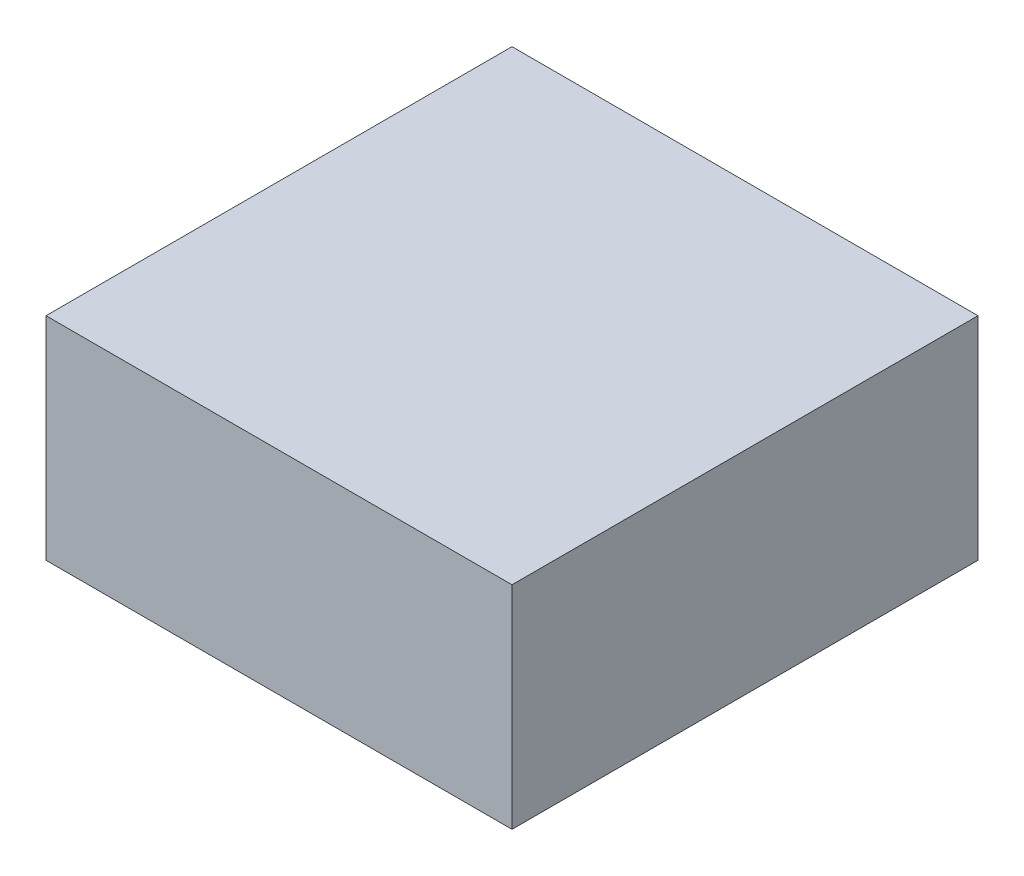
ISO-10303-21;
HEADER;
FILE_DESCRIPTION(('STEP AP214'),'2;1');
FILE_NAME('part.step','',(''),(''),'','','');
FILE_SCHEMA(('AUTOMOTIVE_DESIGN { 1 0 10303 214 1 1 1 1 }'));
ENDSEC;
DATA;
#1=APPLICATION_CONTEXT('core data for automotive mechanical design processes');
#2=APPLICATION_PROTOCOL_DEFINITION('international standard','automotive_design',2000,#1);
#3=PRODUCT_CONTEXT('',#1,'mechanical');
#4=PRODUCT('Part','Part','',(#3));
#5=PRODUCT_RELATED_PRODUCT_CATEGORY('part','',(#4));
#6=PRODUCT_DEFINITION_FORMATION('','',#4);
#7=PRODUCT_DEFINITION_CONTEXT('part definition',#1,'design');
#8=PRODUCT_DEFINITION('design','',#6,#7);
#9=PRODUCT_DEFINITION_SHAPE('','',#8);
#10=(LENGTH_UNIT() NAMED_UNIT(*) SI_UNIT(.MILLI.,.METRE.));
#11=(NAMED_UNIT(*) PLANE_ANGLE_UNIT() SI_UNIT($,.RADIAN.));
#12=(NAMED_UNIT(*) SI_UNIT($,.STERADIAN.) SOLID_ANGLE_UNIT());
#13=UNCERTAINTY_MEASURE_WITH_UNIT(LENGTH_MEASURE(1.E-05),#10,'distance_accuracy_value','');
#14=(GEOMETRIC_REPRESENTATION_CONTEXT(3) GLOBAL_UNCERTAINTY_ASSIGNED_CONTEXT((#13)) GLOBAL_UNIT_ASSIGNED_CONTEXT((#10,
#11,#12)) REPRESENTATION_CONTEXT('',''));
#15=CARTESIAN_POINT('',(0.,0.,0.));
#16=DIRECTION('',(0.,0.,1.));
#17=DIRECTION('',(1.,0.,0.));
#18=AXIS2_PLACEMENT_3D('',#15,#16,#17);
#19=CARTESIAN_POINT('',(139.7,127.,-139.7));
#20=DIRECTION('',(-1.,0.,0.));
#21=DIRECTION('',(0.,0.,1.));
#22=AXIS2_PLACEMENT_3D('',#19,#20,#21);
#23=PLANE('',#22);
#24=DIRECTION('',(0.,0.,-1.));
#25=VECTOR('',#24,1.);
#26=CARTESIAN_POINT('',(139.7,0.,-139.7));
#27=LINE('',#26,#25);
#28=CARTESIAN_POINT('',(139.7,0.,139.7));
#29=VERTEX_POINT('',#28);
#30=CARTESIAN_POINT('',(139.7,0.,-139.7));
#31=VERTEX_POINT('',#30);
#32=EDGE_CURVE('E107',#29,#31,#27,.T.);
#33=ORIENTED_EDGE('',*,*,#32,.T.);
#34=DIRECTION('',(0.,-1.,0.));
#35=VECTOR('',#34,1.);
#36=CARTESIAN_POINT('',(139.7,127.,-139.7));
#37=LINE('',#36,#35);
#38=CARTESIAN_POINT('',(139.7,127.,-139.7));
#39=VERTEX_POINT('',#38);
#40=EDGE_CURVE('E11',#39,#31,#37,.T.);
#41=ORIENTED_EDGE('',*,*,#40,.F.);
#42=DIRECTION('',(0.,0.,-1.));
#43=VECTOR('',#42,1.);
#44=CARTESIAN_POINT('',(139.7,127.,-139.7));
#45=LINE('',#44,#43);
#46=CARTESIAN_POINT('',(139.7,127.,139.7));
#47=VERTEX_POINT('',#46);
#48=EDGE_CURVE('E91',#47,#39,#45,.T.);
#49=ORIENTED_EDGE('',*,*,#48,.F.);
#50=DIRECTION('',(0.,-1.,0.));
#51=VECTOR('',#50,1.);
#52=CARTESIAN_POINT('',(139.7,127.,139.7));
#53=LINE('',#52,#51);
#54=EDGE_CURVE('E103',#47,#29,#53,.T.);
#55=ORIENTED_EDGE('',*,*,#54,.T.);
#56=EDGE_LOOP('',(#33,#41,#49,#55));
#57=FACE_BOUND('',#56,.T.);
#58=ADVANCED_FACE('F39',(#57),#23,.F.);
#59=CARTESIAN_POINT('',(-139.7,127.,-139.7));
#60=DIRECTION('',(0.,0.,1.));
#61=DIRECTION('',(1.,0.,0.));
#62=AXIS2_PLACEMENT_3D('',#59,#60,#61);
#63=PLANE('',#62);
#64=DIRECTION('',(-1.,0.,0.));
#65=VECTOR('',#64,1.);
#66=CARTESIAN_POINT('',(-139.7,0.,-139.7));
#67=LINE('',#66,#65);
#68=CARTESIAN_POINT('',(-139.7,0.,-139.7));
#69=VERTEX_POINT('',#68);
#70=EDGE_CURVE('E96',#31,#69,#67,.T.);
#71=ORIENTED_EDGE('',*,*,#70,.T.);
#72=DIRECTION('',(0.,-1.,0.));
#73=VECTOR('',#72,1.);
#74=CARTESIAN_POINT('',(-139.7,127.,-139.7));
#75=LINE('',#74,#73);
#76=CARTESIAN_POINT('',(-139.7,127.,-139.7));
#77=VERTEX_POINT('',#76);
#78=EDGE_CURVE('E48',#77,#69,#75,.T.);
#79=ORIENTED_EDGE('',*,*,#78,.F.);
#80=DIRECTION('',(-1.,0.,0.));
#81=VECTOR('',#80,1.);
#82=CARTESIAN_POINT('',(-139.7,127.,-139.7));
#83=LINE('',#82,#81);
#84=EDGE_CURVE('E86',#39,#77,#83,.T.);
#85=ORIENTED_EDGE('',*,*,#84,.F.);
#86=ORIENTED_EDGE('',*,*,#40,.T.);
#87=EDGE_LOOP('',(#71,#79,#85,#86));
#88=FACE_BOUND('',#87,.T.);
#89=ADVANCED_FACE('F95',(#88),#63,.F.);
#90=CARTESIAN_POINT('',(-139.7,127.,-139.7));
#91=DIRECTION('',(1.,0.,0.));
#92=DIRECTION('',(0.,0.,-1.));
#93=AXIS2_PLACEMENT_3D('',#90,#91,#92);
#94=PLANE('',#93);
#95=DIRECTION('',(0.,0.,1.));
#96=VECTOR('',#95,1.);
#97=CARTESIAN_POINT('',(-139.7,0.,-139.7));
#98=LINE('',#97,#96);
#99=CARTESIAN_POINT('',(-139.7,0.,139.7));
#100=VERTEX_POINT('',#99);
#101=EDGE_CURVE('E73',#69,#100,#98,.T.);
#102=ORIENTED_EDGE('',*,*,#101,.T.);
#103=DIRECTION('',(0.,-1.,0.));
#104=VECTOR('',#103,1.);
#105=CARTESIAN_POINT('',(-139.7,127.,139.7));
#106=LINE('',#105,#104);
#107=CARTESIAN_POINT('',(-139.7,127.,139.7));
#108=VERTEX_POINT('',#107);
#109=EDGE_CURVE('E98',#108,#100,#106,.T.);
#110=ORIENTED_EDGE('',*,*,#109,.F.);
#111=DIRECTION('',(0.,0.,1.));
#112=VECTOR('',#111,1.);
#113=CARTESIAN_POINT('',(-139.7,127.,-139.7));
#114=LINE('',#113,#112);
#115=EDGE_CURVE('E89',#77,#108,#114,.T.);
#116=ORIENTED_EDGE('',*,*,#115,.F.);
#117=ORIENTED_EDGE('',*,*,#78,.T.);
#118=EDGE_LOOP('',(#102,#110,#116,#117));
#119=FACE_BOUND('',#118,.T.);
#120=ADVANCED_FACE('F99',(#119),#94,.F.);
#121=CARTESIAN_POINT('',(-139.7,127.,139.7));
#122=DIRECTION('',(0.,0.,-1.));
#123=DIRECTION('',(-1.,0.,0.));
#124=AXIS2_PLACEMENT_3D('',#121,#122,#123);
#125=PLANE('',#124);
#126=DIRECTION('',(1.,0.,0.));
#127=VECTOR('',#126,1.);
#128=CARTESIAN_POINT('',(-139.7,0.,139.7));
#129=LINE('',#128,#127);
#130=EDGE_CURVE('E79',#100,#29,#129,.T.);
#131=ORIENTED_EDGE('',*,*,#130,.T.);
#132=ORIENTED_EDGE('',*,*,#54,.F.);
#133=DIRECTION('',(1.,0.,0.));
#134=VECTOR('',#133,1.);
#135=CARTESIAN_POINT('',(-139.7,127.,139.7));
#136=LINE('',#135,#134);
#137=EDGE_CURVE('E56',#108,#47,#136,.T.);
#138=ORIENTED_EDGE('',*,*,#137,.F.);
#139=ORIENTED_EDGE('',*,*,#109,.T.);
#140=EDGE_LOOP('',(#131,#132,#138,#139));
#141=FACE_BOUND('',#140,.T.);
#142=ADVANCED_FACE('F120',(#141),#125,.F.);
#143=CARTESIAN_POINT('',(0.,127.,0.));
#144=DIRECTION('',(0.,1.,0.));
#145=DIRECTION('',(0.,0.,1.));
#146=AXIS2_PLACEMENT_3D('',#143,#144,#145);
#147=PLANE('',#146);
#148=ORIENTED_EDGE('',*,*,#48,.T.);
#149=ORIENTED_EDGE('',*,*,#84,.T.);
#150=ORIENTED_EDGE('',*,*,#115,.T.);
#151=ORIENTED_EDGE('',*,*,#137,.T.);
#152=EDGE_LOOP('',(#148,#149,#150,#151));
#153=FACE_BOUND('',#152,.T.);
#154=ADVANCED_FACE('F87',(#153),#147,.T.);
#155=CARTESIAN_POINT('',(0.,0.,0.));
#156=DIRECTION('',(0.,1.,0.));
#157=DIRECTION('',(0.,0.,1.));
#158=AXIS2_PLACEMENT_3D('',#155,#156,#157);
#159=PLANE('',#158);
#160=ORIENTED_EDGE('',*,*,#32,.F.);
#161=ORIENTED_EDGE('',*,*,#130,.F.);
#162=ORIENTED_EDGE('',*,*,#101,.F.);
#163=ORIENTED_EDGE('',*,*,#70,.F.);
#164=EDGE_LOOP('',(#160,#161,#162,#163));
#165=FACE_BOUND('',#164,.T.);
#166=ADVANCED_FACE('F123',(#165),#159,.F.);
#167=CLOSED_SHELL('',(#58,#89,#120,#142,#154,#166));
#168=MANIFOLD_SOLID_BREP('B2',#167);
#169=ADVANCED_BREP_SHAPE_REPRESENTATION('',(#18,#168),#14);
#170=SHAPE_DEFINITION_REPRESENTATION(#9,#169);
ENDSEC;
END-ISO-10303-21;
